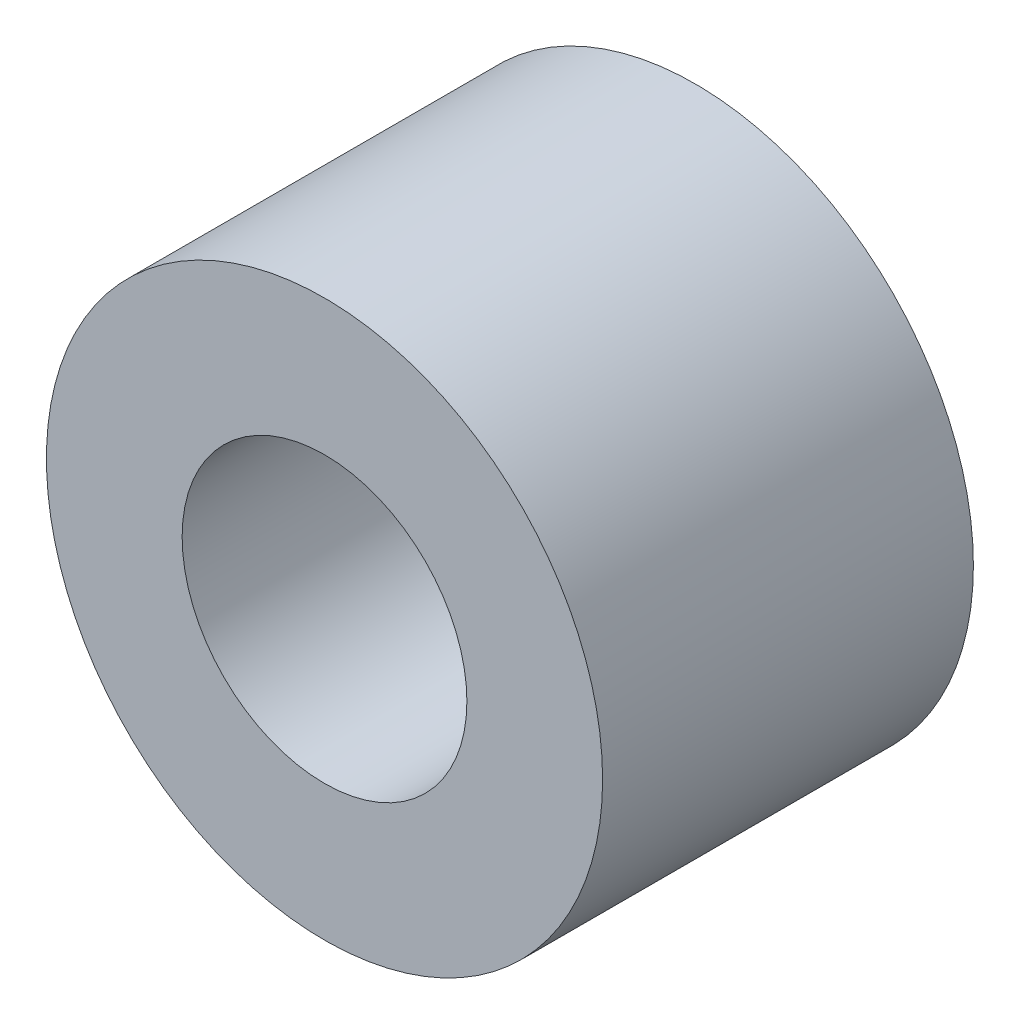
ISO-10303-21;
HEADER;
FILE_DESCRIPTION(('STEP AP214'),'2;1');
FILE_NAME('part.step','',(''),(''),'','','');
FILE_SCHEMA(('AUTOMOTIVE_DESIGN { 1 0 10303 214 1 1 1 1 }'));
ENDSEC;
DATA;
#1=APPLICATION_CONTEXT('core data for automotive mechanical design processes');
#2=APPLICATION_PROTOCOL_DEFINITION('international standard','automotive_design',2000,#1);
#3=PRODUCT_CONTEXT('',#1,'mechanical');
#4=PRODUCT('Part','Part','',(#3));
#5=PRODUCT_RELATED_PRODUCT_CATEGORY('part','',(#4));
#6=PRODUCT_DEFINITION_FORMATION('','',#4);
#7=PRODUCT_DEFINITION_CONTEXT('part definition',#1,'design');
#8=PRODUCT_DEFINITION('design','',#6,#7);
#9=PRODUCT_DEFINITION_SHAPE('','',#8);
#10=(LENGTH_UNIT() NAMED_UNIT(*) SI_UNIT(.MILLI.,.METRE.));
#11=(NAMED_UNIT(*) PLANE_ANGLE_UNIT() SI_UNIT($,.RADIAN.));
#12=(NAMED_UNIT(*) SI_UNIT($,.STERADIAN.) SOLID_ANGLE_UNIT());
#13=UNCERTAINTY_MEASURE_WITH_UNIT(LENGTH_MEASURE(1.E-05),#10,'distance_accuracy_value','');
#14=(GEOMETRIC_REPRESENTATION_CONTEXT(3) GLOBAL_UNCERTAINTY_ASSIGNED_CONTEXT((#13)) GLOBAL_UNIT_ASSIGNED_CONTEXT((#10,
#11,#12)) REPRESENTATION_CONTEXT('',''));
#15=CARTESIAN_POINT('',(0.,0.,0.));
#16=DIRECTION('',(0.,0.,1.));
#17=DIRECTION('',(1.,0.,0.));
#18=AXIS2_PLACEMENT_3D('',#15,#16,#17);
#19=CARTESIAN_POINT('',(0.,0.,3.175));
#20=DIRECTION('',(0.,0.,1.));
#21=DIRECTION('',(1.,0.,0.));
#22=AXIS2_PLACEMENT_3D('',#19,#20,#21);
#23=PLANE('',#22);
#24=CARTESIAN_POINT('',(0.,0.,3.175));
#25=DIRECTION('',(0.,0.,1.));
#26=DIRECTION('',(1.,0.,0.));
#27=AXIS2_PLACEMENT_3D('',#24,#25,#26);
#28=CIRCLE('',#27,4.7625);
#29=CARTESIAN_POINT('',(4.7625,0.,3.175));
#30=VERTEX_POINT('',#29);
#31=EDGE_CURVE('E10',#30,#30,#28,.T.);
#32=ORIENTED_EDGE('',*,*,#31,.T.);
#33=EDGE_LOOP('',(#32));
#34=FACE_BOUND('',#33,.T.);
#35=CARTESIAN_POINT('',(0.,0.,3.175));
#36=DIRECTION('',(0.,0.,1.));
#37=DIRECTION('',(1.,0.,0.));
#38=AXIS2_PLACEMENT_3D('',#35,#36,#37);
#39=CIRCLE('',#38,2.4384);
#40=CARTESIAN_POINT('',(2.4384,0.,3.175));
#41=VERTEX_POINT('',#40);
#42=EDGE_CURVE('E41',#41,#41,#39,.T.);
#43=ORIENTED_EDGE('',*,*,#42,.F.);
#44=EDGE_LOOP('',(#43));
#45=FACE_BOUND('',#44,.T.);
#46=ADVANCED_FACE('F30',(#34,#45),#23,.T.);
#47=CARTESIAN_POINT('',(0.,0.,-3.175));
#48=DIRECTION('',(0.,0.,1.));
#49=DIRECTION('',(1.,0.,0.));
#50=AXIS2_PLACEMENT_3D('',#47,#48,#49);
#51=PLANE('',#50);
#52=CARTESIAN_POINT('',(0.,0.,-3.175));
#53=DIRECTION('',(0.,0.,1.));
#54=DIRECTION('',(1.,0.,0.));
#55=AXIS2_PLACEMENT_3D('',#52,#53,#54);
#56=CIRCLE('',#55,4.7625);
#57=CARTESIAN_POINT('',(4.7625,0.,-3.175));
#58=VERTEX_POINT('',#57);
#59=EDGE_CURVE('E34',#58,#58,#56,.T.);
#60=ORIENTED_EDGE('',*,*,#59,.F.);
#61=EDGE_LOOP('',(#60));
#62=FACE_BOUND('',#61,.T.);
#63=CARTESIAN_POINT('',(0.,0.,-3.175));
#64=DIRECTION('',(0.,0.,1.));
#65=DIRECTION('',(1.,0.,0.));
#66=AXIS2_PLACEMENT_3D('',#63,#64,#65);
#67=CIRCLE('',#66,2.4384);
#68=CARTESIAN_POINT('',(2.4384,0.,-3.175));
#69=VERTEX_POINT('',#68);
#70=EDGE_CURVE('E43',#69,#69,#67,.T.);
#71=ORIENTED_EDGE('',*,*,#70,.T.);
#72=EDGE_LOOP('',(#71));
#73=FACE_BOUND('',#72,.T.);
#74=ADVANCED_FACE('F53',(#62,#73),#51,.F.);
#75=CARTESIAN_POINT('',(0.,0.,3.175));
#76=DIRECTION('',(0.,0.,-1.));
#77=DIRECTION('',(-1.,0.,0.));
#78=AXIS2_PLACEMENT_3D('',#75,#76,#77);
#79=CYLINDRICAL_SURFACE('',#78,4.7625);
#80=ORIENTED_EDGE('',*,*,#31,.F.);
#81=EDGE_LOOP('',(#80));
#82=FACE_BOUND('',#81,.T.);
#83=ORIENTED_EDGE('',*,*,#59,.T.);
#84=EDGE_LOOP('',(#83));
#85=FACE_BOUND('',#84,.T.);
#86=ADVANCED_FACE('F32',(#82,#85),#79,.T.);
#87=CARTESIAN_POINT('',(0.,0.,3.175));
#88=DIRECTION('',(0.,0.,-1.));
#89=DIRECTION('',(-1.,0.,0.));
#90=AXIS2_PLACEMENT_3D('',#87,#88,#89);
#91=CYLINDRICAL_SURFACE('',#90,2.4384);
#92=ORIENTED_EDGE('',*,*,#42,.T.);
#93=EDGE_LOOP('',(#92));
#94=FACE_BOUND('',#93,.T.);
#95=ORIENTED_EDGE('',*,*,#70,.F.);
#96=EDGE_LOOP('',(#95));
#97=FACE_BOUND('',#96,.T.);
#98=ADVANCED_FACE('F49',(#94,#97),#91,.F.);
#99=CLOSED_SHELL('',(#46,#74,#86,#98));
#100=MANIFOLD_SOLID_BREP('B2',#99);
#101=ADVANCED_BREP_SHAPE_REPRESENTATION('',(#18,#100),#14);
#102=SHAPE_DEFINITION_REPRESENTATION(#9,#101);
ENDSEC;
END-ISO-10303-21;
